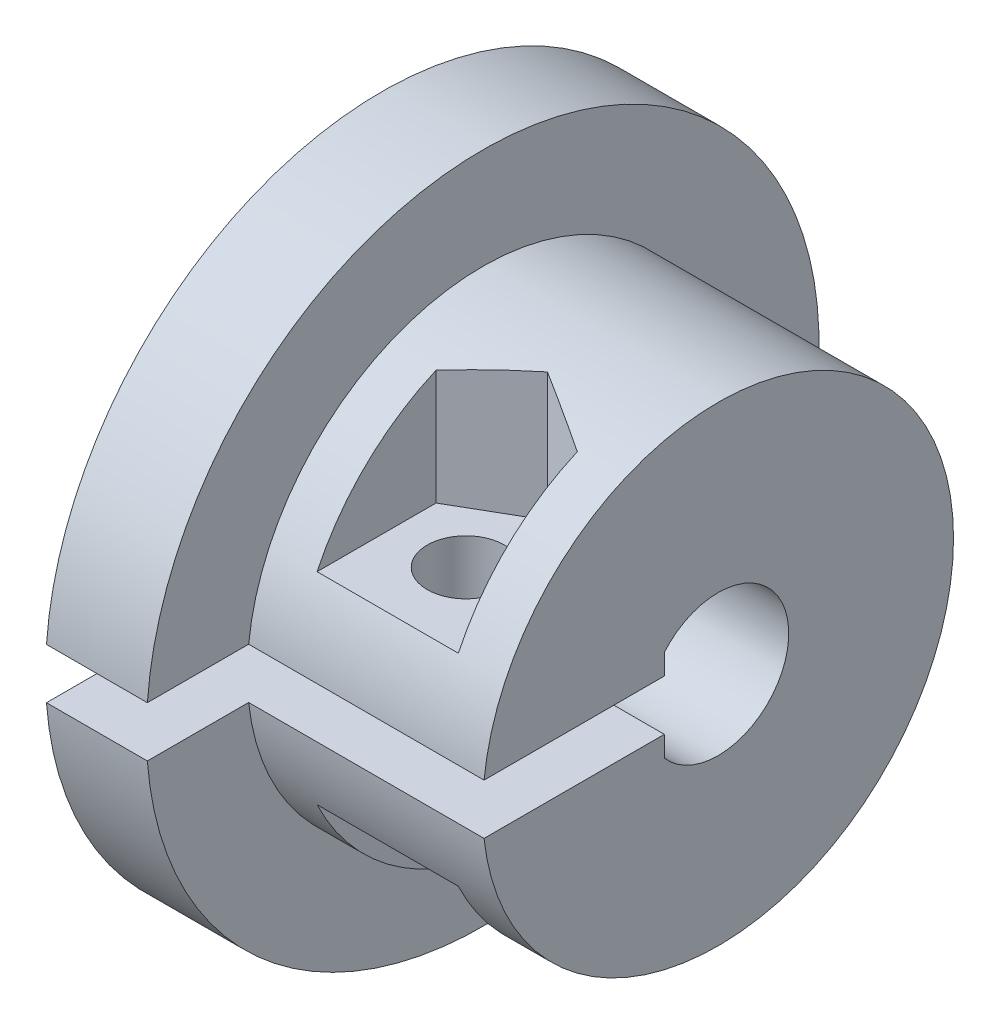
ISO-10303-21;
HEADER;
FILE_DESCRIPTION(('STEP AP214'),'2;1');
FILE_NAME('part.step','',(''),(''),'','','');
FILE_SCHEMA(('AUTOMOTIVE_DESIGN { 1 0 10303 214 1 1 1 1 }'));
ENDSEC;
DATA;
#1=APPLICATION_CONTEXT('core data for automotive mechanical design processes');
#2=APPLICATION_PROTOCOL_DEFINITION('international standard','automotive_design',2000,#1);
#3=PRODUCT_CONTEXT('',#1,'mechanical');
#4=PRODUCT('Part','Part','',(#3));
#5=PRODUCT_RELATED_PRODUCT_CATEGORY('part','',(#4));
#6=PRODUCT_DEFINITION_FORMATION('','',#4);
#7=PRODUCT_DEFINITION_CONTEXT('part definition',#1,'design');
#8=PRODUCT_DEFINITION('design','',#6,#7);
#9=PRODUCT_DEFINITION_SHAPE('','',#8);
#10=(LENGTH_UNIT() NAMED_UNIT(*) SI_UNIT(.MILLI.,.METRE.));
#11=(NAMED_UNIT(*) PLANE_ANGLE_UNIT() SI_UNIT($,.RADIAN.));
#12=(NAMED_UNIT(*) SI_UNIT($,.STERADIAN.) SOLID_ANGLE_UNIT());
#13=UNCERTAINTY_MEASURE_WITH_UNIT(LENGTH_MEASURE(1.E-05),#10,'distance_accuracy_value','');
#14=(GEOMETRIC_REPRESENTATION_CONTEXT(3) GLOBAL_UNCERTAINTY_ASSIGNED_CONTEXT((#13)) GLOBAL_UNIT_ASSIGNED_CONTEXT((#10,
#11,#12)) REPRESENTATION_CONTEXT('',''));
#15=CARTESIAN_POINT('',(0.,0.,0.));
#16=DIRECTION('',(0.,0.,1.));
#17=DIRECTION('',(1.,0.,0.));
#18=AXIS2_PLACEMENT_3D('',#15,#16,#17);
#19=CARTESIAN_POINT('',(0.,0.,0.));
#20=DIRECTION('',(1.,0.,0.));
#21=DIRECTION('',(0.,1.,0.));
#22=AXIS2_PLACEMENT_3D('',#19,#20,#21);
#23=PLANE('',#22);
#24=CARTESIAN_POINT('',(0.,-5.,0.));
#25=DIRECTION('',(1.,0.,0.));
#26=DIRECTION('',(0.,0.,1.));
#27=AXIS2_PLACEMENT_3D('',#24,#25,#26);
#28=CIRCLE('',#27,3.25);
#29=CARTESIAN_POINT('',(0.,-5.,-3.25));
#30=VERTEX_POINT('',#29);
#31=EDGE_CURVE('E303',#30,#30,#28,.T.);
#32=ORIENTED_EDGE('',*,*,#31,.T.);
#33=EDGE_LOOP('',(#32));
#34=FACE_BOUND('',#33,.T.);
#35=CARTESIAN_POINT('',(0.,5.,0.));
#36=DIRECTION('',(1.,0.,0.));
#37=DIRECTION('',(0.,0.,1.));
#38=AXIS2_PLACEMENT_3D('',#35,#36,#37);
#39=CIRCLE('',#38,3.25);
#40=CARTESIAN_POINT('',(0.,5.,-3.25));
#41=VERTEX_POINT('',#40);
#42=EDGE_CURVE('E191',#41,#41,#39,.T.);
#43=ORIENTED_EDGE('',*,*,#42,.T.);
#44=EDGE_LOOP('',(#43));
#45=FACE_BOUND('',#44,.T.);
#46=DIRECTION('',(0.,0.,1.));
#47=VECTOR('',#46,1.);
#48=CARTESIAN_POINT('',(0.,0.75,4.98591766879478));
#49=LINE('',#48,#47);
#50=CARTESIAN_POINT('',(0.,0.75,0.));
#51=VERTEX_POINT('',#50);
#52=CARTESIAN_POINT('',(0.,0.75,9.97183533758957));
#53=VERTEX_POINT('',#52);
#54=EDGE_CURVE('E196',#51,#53,#49,.T.);
#55=ORIENTED_EDGE('',*,*,#54,.T.);
#56=CARTESIAN_POINT('',(0.,0.,0.));
#57=DIRECTION('',(1.,0.,0.));
#58=DIRECTION('',(0.,0.,-1.));
#59=AXIS2_PLACEMENT_3D('',#56,#57,#58);
#60=CIRCLE('',#59,10.);
#61=CARTESIAN_POINT('',(0.,-0.74999999999999,9.97183533758957));
#62=VERTEX_POINT('',#61);
#63=EDGE_CURVE('E11',#62,#53,#60,.T.);
#64=ORIENTED_EDGE('',*,*,#63,.F.);
#65=DIRECTION('',(0.,0.,-1.));
#66=VECTOR('',#65,1.);
#67=CARTESIAN_POINT('',(0.,-0.75,0.));
#68=LINE('',#67,#66);
#69=CARTESIAN_POINT('',(0.,-0.75,0.));
#70=VERTEX_POINT('',#69);
#71=EDGE_CURVE('E216',#62,#70,#68,.T.);
#72=ORIENTED_EDGE('',*,*,#71,.T.);
#73=CARTESIAN_POINT('',(0.,0.,0.));
#74=DIRECTION('',(1.,0.,0.));
#75=DIRECTION('',(0.,-1.,0.));
#76=AXIS2_PLACEMENT_3D('',#73,#74,#75);
#77=CIRCLE('',#76,0.75);
#78=EDGE_CURVE('E352',#70,#51,#77,.T.);
#79=ORIENTED_EDGE('',*,*,#78,.T.);
#80=EDGE_LOOP('',(#55,#64,#72,#79));
#81=FACE_BOUND('',#80,.T.);
#82=ADVANCED_FACE('F17',(#34,#45,#81),#23,.F.);
#83=CARTESIAN_POINT('',(3.,0.,0.));
#84=DIRECTION('',(1.,0.,0.));
#85=DIRECTION('',(0.,1.,0.));
#86=AXIS2_PLACEMENT_3D('',#83,#84,#85);
#87=PLANE('',#86);
#88=DIRECTION('',(0.,0.,-1.));
#89=VECTOR('',#88,1.);
#90=CARTESIAN_POINT('',(3.,0.75,4.98591766879478));
#91=LINE('',#90,#89);
#92=CARTESIAN_POINT('',(3.,0.75,9.97183533758957));
#93=VERTEX_POINT('',#92);
#94=CARTESIAN_POINT('',(3.,0.75,6.95970545353753));
#95=VERTEX_POINT('',#94);
#96=EDGE_CURVE('E336',#93,#95,#91,.T.);
#97=ORIENTED_EDGE('',*,*,#96,.T.);
#98=CARTESIAN_POINT('',(3.,0.,0.));
#99=DIRECTION('',(-1.,0.,0.));
#100=DIRECTION('',(0.,0.,-1.));
#101=AXIS2_PLACEMENT_3D('',#98,#99,#100);
#102=CIRCLE('',#101,7.);
#103=CARTESIAN_POINT('',(3.,-0.75,6.95970545353753));
#104=VERTEX_POINT('',#103);
#105=EDGE_CURVE('E291',#95,#104,#102,.T.);
#106=ORIENTED_EDGE('',*,*,#105,.T.);
#107=DIRECTION('',(0.,0.,1.));
#108=VECTOR('',#107,1.);
#109=CARTESIAN_POINT('',(3.,-0.75,0.));
#110=LINE('',#109,#108);
#111=CARTESIAN_POINT('',(3.,-0.75,9.97183533758957));
#112=VERTEX_POINT('',#111);
#113=EDGE_CURVE('E231',#104,#112,#110,.T.);
#114=ORIENTED_EDGE('',*,*,#113,.T.);
#115=CARTESIAN_POINT('',(3.,0.,0.));
#116=DIRECTION('',(1.,0.,0.));
#117=DIRECTION('',(0.,0.,-1.));
#118=AXIS2_PLACEMENT_3D('',#115,#116,#117);
#119=CIRCLE('',#118,10.);
#120=EDGE_CURVE('E28',#112,#93,#119,.T.);
#121=ORIENTED_EDGE('',*,*,#120,.T.);
#122=EDGE_LOOP('',(#97,#106,#114,#121));
#123=FACE_BOUND('',#122,.T.);
#124=ADVANCED_FACE('F418',(#123),#87,.T.);
#125=CARTESIAN_POINT('',(0.,0.,0.));
#126=DIRECTION('',(1.,0.,0.));
#127=DIRECTION('',(0.,0.,-1.));
#128=AXIS2_PLACEMENT_3D('',#125,#126,#127);
#129=CYLINDRICAL_SURFACE('',#128,10.);
#130=DIRECTION('',(1.,0.,0.));
#131=VECTOR('',#130,1.);
#132=CARTESIAN_POINT('',(0.,0.75,9.97183533758957));
#133=LINE('',#132,#131);
#134=EDGE_CURVE('E200',#53,#93,#133,.T.);
#135=ORIENTED_EDGE('',*,*,#134,.T.);
#136=ORIENTED_EDGE('',*,*,#120,.F.);
#137=DIRECTION('',(-1.,0.,0.));
#138=VECTOR('',#137,1.);
#139=CARTESIAN_POINT('',(0.,-0.75,9.97183533758957));
#140=LINE('',#139,#138);
#141=EDGE_CURVE('E227',#112,#62,#140,.T.);
#142=ORIENTED_EDGE('',*,*,#141,.T.);
#143=ORIENTED_EDGE('',*,*,#63,.T.);
#144=EDGE_LOOP('',(#135,#136,#142,#143));
#145=FACE_BOUND('',#144,.T.);
#146=ADVANCED_FACE('F426',(#145),#129,.T.);
#147=CARTESIAN_POINT('',(10.,-1.36014705087354,1.6));
#148=DIRECTION('',(0.,0.,1.));
#149=DIRECTION('',(0.,-1.,0.));
#150=AXIS2_PLACEMENT_3D('',#147,#148,#149);
#151=PLANE('',#150);
#152=DIRECTION('',(-1.,0.,0.));
#153=VECTOR('',#152,1.);
#154=CARTESIAN_POINT('',(10.,0.75,1.6));
#155=LINE('',#154,#153);
#156=CARTESIAN_POINT('',(10.,0.75,1.6));
#157=VERTEX_POINT('',#156);
#158=CARTESIAN_POINT('',(3.,0.75,1.6));
#159=VERTEX_POINT('',#158);
#160=EDGE_CURVE('E232',#157,#159,#155,.T.);
#161=ORIENTED_EDGE('',*,*,#160,.T.);
#162=DIRECTION('',(0.,1.,0.));
#163=VECTOR('',#162,1.);
#164=CARTESIAN_POINT('',(3.,1.36014705087354,1.6));
#165=LINE('',#164,#163);
#166=CARTESIAN_POINT('',(3.,1.36014705087354,1.6));
#167=VERTEX_POINT('',#166);
#168=EDGE_CURVE('E188',#159,#167,#165,.T.);
#169=ORIENTED_EDGE('',*,*,#168,.T.);
#170=DIRECTION('',(-1.,0.,0.));
#171=VECTOR('',#170,1.);
#172=CARTESIAN_POINT('',(10.,1.36014705087354,1.6));
#173=LINE('',#172,#171);
#174=CARTESIAN_POINT('',(10.,1.36014705087354,1.6));
#175=VERTEX_POINT('',#174);
#176=EDGE_CURVE('E184',#175,#167,#173,.T.);
#177=ORIENTED_EDGE('',*,*,#176,.F.);
#178=DIRECTION('',(0.,1.,0.));
#179=VECTOR('',#178,1.);
#180=CARTESIAN_POINT('',(10.,-0.680073525436771,1.6));
#181=LINE('',#180,#179);
#182=EDGE_CURVE('E241',#157,#175,#181,.T.);
#183=ORIENTED_EDGE('',*,*,#182,.F.);
#184=EDGE_LOOP('',(#161,#169,#177,#183));
#185=FACE_BOUND('',#184,.T.);
#186=ADVANCED_FACE('F568',(#185),#151,.F.);
#187=CARTESIAN_POINT('',(10.,0.,0.));
#188=DIRECTION('',(-1.,0.,0.));
#189=DIRECTION('',(0.,0.,-1.));
#190=AXIS2_PLACEMENT_3D('',#187,#188,#189);
#191=CYLINDRICAL_SURFACE('',#190,2.1);
#192=CARTESIAN_POINT('',(10.,0.,0.));
#193=DIRECTION('',(-1.,0.,0.));
#194=DIRECTION('',(0.,-0.647689071844544,0.761904761904763));
#195=AXIS2_PLACEMENT_3D('',#192,#193,#194);
#196=CIRCLE('',#195,2.1);
#197=CARTESIAN_POINT('',(10.,-1.36014705087354,1.6));
#198=VERTEX_POINT('',#197);
#199=EDGE_CURVE('E245',#175,#198,#196,.T.);
#200=ORIENTED_EDGE('',*,*,#199,.F.);
#201=ORIENTED_EDGE('',*,*,#176,.T.);
#202=CARTESIAN_POINT('',(3.,0.,0.));
#203=DIRECTION('',(-1.,0.,0.));
#204=DIRECTION('',(0.,-0.647689071844544,0.761904761904763));
#205=AXIS2_PLACEMENT_3D('',#202,#203,#204);
#206=CIRCLE('',#205,2.1);
#207=CARTESIAN_POINT('',(3.,-1.36014705087354,1.6));
#208=VERTEX_POINT('',#207);
#209=EDGE_CURVE('E185',#167,#208,#206,.T.);
#210=ORIENTED_EDGE('',*,*,#209,.T.);
#211=DIRECTION('',(-1.,0.,0.));
#212=VECTOR('',#211,1.);
#213=CARTESIAN_POINT('',(10.,-1.36014705087354,1.6));
#214=LINE('',#213,#212);
#215=EDGE_CURVE('E246',#198,#208,#214,.T.);
#216=ORIENTED_EDGE('',*,*,#215,.F.);
#217=EDGE_LOOP('',(#200,#201,#210,#216));
#218=FACE_BOUND('',#217,.T.);
#219=ADVANCED_FACE('F597',(#218),#191,.F.);
#220=CARTESIAN_POINT('',(8.6,3.,7.));
#221=DIRECTION('',(1.,0.,0.));
#222=DIRECTION('',(0.,0.,1.));
#223=AXIS2_PLACEMENT_3D('',#220,#221,#222);
#224=PLANE('',#223);
#225=CARTESIAN_POINT('',(8.6,0.,0.));
#226=DIRECTION('',(1.,0.,0.));
#227=DIRECTION('',(0.,0.,-1.));
#228=AXIS2_PLACEMENT_3D('',#225,#226,#227);
#229=CIRCLE('',#228,7.);
#230=CARTESIAN_POINT('',(8.6,6.42101896293615,2.7875644347018));
#231=VERTEX_POINT('',#230);
#232=CARTESIAN_POINT('',(8.6,3.,6.32455532033676));
#233=VERTEX_POINT('',#232);
#234=EDGE_CURVE('E163',#231,#233,#229,.T.);
#235=ORIENTED_EDGE('',*,*,#234,.F.);
#236=DIRECTION('',(0.,1.,0.));
#237=VECTOR('',#236,1.);
#238=CARTESIAN_POINT('',(8.6,3.,2.7875644347018));
#239=LINE('',#238,#237);
#240=CARTESIAN_POINT('',(8.6,3.,2.7875644347018));
#241=VERTEX_POINT('',#240);
#242=EDGE_CURVE('E156',#241,#231,#239,.T.);
#243=ORIENTED_EDGE('',*,*,#242,.F.);
#244=DIRECTION('',(0.,0.,-1.));
#245=VECTOR('',#244,1.);
#246=CARTESIAN_POINT('',(8.6,3.,7.));
#247=LINE('',#246,#245);
#248=EDGE_CURVE('E113',#233,#241,#247,.T.);
#249=ORIENTED_EDGE('',*,*,#248,.F.);
#250=EDGE_LOOP('',(#235,#243,#249));
#251=FACE_BOUND('',#250,.T.);
#252=ADVANCED_FACE('F583',(#251),#224,.F.);
#253=CARTESIAN_POINT('',(8.6,3.,2.7875644347018));
#254=DIRECTION('',(0.5,0.,-0.866025403784436));
#255=DIRECTION('',(0.,-1.,0.));
#256=AXIS2_PLACEMENT_3D('',#253,#254,#255);
#257=PLANE('',#256);
#258=CARTESIAN_POINT('',(3.77179676972451,0.,0.));
#259=DIRECTION('',(0.5,0.,-0.866025403784436));
#260=DIRECTION('',(-0.866025403784436,0.,-0.5));
#261=AXIS2_PLACEMENT_3D('',#258,#259,#260);
#262=ELLIPSE('',#261,14.,7.);
#263=CARTESIAN_POINT('',(6.5,6.82048158451963,1.57512886940357));
#264=VERTEX_POINT('',#263);
#265=EDGE_CURVE('E159',#264,#231,#262,.T.);
#266=ORIENTED_EDGE('',*,*,#265,.F.);
#267=DIRECTION('',(0.,1.,0.));
#268=VECTOR('',#267,1.);
#269=CARTESIAN_POINT('',(6.5,3.,1.57512886940357));
#270=LINE('',#269,#268);
#271=CARTESIAN_POINT('',(6.5,3.,1.57512886940357));
#272=VERTEX_POINT('',#271);
#273=EDGE_CURVE('E144',#272,#264,#270,.T.);
#274=ORIENTED_EDGE('',*,*,#273,.F.);
#275=DIRECTION('',(0.866025403784436,0.,0.5));
#276=VECTOR('',#275,1.);
#277=CARTESIAN_POINT('',(6.5,3.,1.57512886940357));
#278=LINE('',#277,#276);
#279=EDGE_CURVE('E209',#272,#241,#278,.T.);
#280=ORIENTED_EDGE('',*,*,#279,.T.);
#281=ORIENTED_EDGE('',*,*,#242,.T.);
#282=EDGE_LOOP('',(#266,#274,#280,#281));
#283=FACE_BOUND('',#282,.T.);
#284=ADVANCED_FACE('F160',(#283),#257,.F.);
#285=CARTESIAN_POINT('',(6.5,3.,1.57512886940357));
#286=DIRECTION('',(-0.5,0.,-0.866025403784439));
#287=DIRECTION('',(-0.866025403784439,0.,0.5));
#288=AXIS2_PLACEMENT_3D('',#285,#286,#287);
#289=PLANE('',#288);
#290=CARTESIAN_POINT('',(9.22820323027552,0.,0.));
#291=DIRECTION('',(-0.5,0.,-0.866025403784439));
#292=DIRECTION('',(0.866025403784439,0.,-0.5));
#293=AXIS2_PLACEMENT_3D('',#290,#291,#292);
#294=ELLIPSE('',#293,14.,7.);
#295=CARTESIAN_POINT('',(4.4,6.42101896293616,2.78756443470178));
#296=VERTEX_POINT('',#295);
#297=EDGE_CURVE('E148',#296,#264,#294,.T.);
#298=ORIENTED_EDGE('',*,*,#297,.F.);
#299=DIRECTION('',(0.,1.,0.));
#300=VECTOR('',#299,1.);
#301=CARTESIAN_POINT('',(4.4,3.,2.78756443470178));
#302=LINE('',#301,#300);
#303=CARTESIAN_POINT('',(4.4,3.,2.78756443470178));
#304=VERTEX_POINT('',#303);
#305=EDGE_CURVE('E42',#304,#296,#302,.T.);
#306=ORIENTED_EDGE('',*,*,#305,.F.);
#307=DIRECTION('',(0.866025403784439,0.,-0.5));
#308=VECTOR('',#307,1.);
#309=CARTESIAN_POINT('',(4.4,3.,2.78756443470178));
#310=LINE('',#309,#308);
#311=EDGE_CURVE('E151',#304,#272,#310,.T.);
#312=ORIENTED_EDGE('',*,*,#311,.T.);
#313=ORIENTED_EDGE('',*,*,#273,.T.);
#314=EDGE_LOOP('',(#298,#306,#312,#313));
#315=FACE_BOUND('',#314,.T.);
#316=ADVANCED_FACE('F146',(#315),#289,.F.);
#317=CARTESIAN_POINT('',(4.4,3.,2.78756443470178));
#318=DIRECTION('',(-1.,0.,0.));
#319=DIRECTION('',(0.,1.,0.));
#320=AXIS2_PLACEMENT_3D('',#317,#318,#319);
#321=PLANE('',#320);
#322=CARTESIAN_POINT('',(4.4,0.,0.));
#323=DIRECTION('',(-1.,0.,0.));
#324=DIRECTION('',(0.,0.,-1.));
#325=AXIS2_PLACEMENT_3D('',#322,#323,#324);
#326=CIRCLE('',#325,7.);
#327=CARTESIAN_POINT('',(4.4,3.,6.32455532033676));
#328=VERTEX_POINT('',#327);
#329=EDGE_CURVE('E168',#328,#296,#326,.T.);
#330=ORIENTED_EDGE('',*,*,#329,.F.);
#331=DIRECTION('',(0.,0.,1.));
#332=VECTOR('',#331,1.);
#333=CARTESIAN_POINT('',(4.4,3.,2.78756443470178));
#334=LINE('',#333,#332);
#335=EDGE_CURVE('E181',#304,#328,#334,.T.);
#336=ORIENTED_EDGE('',*,*,#335,.F.);
#337=ORIENTED_EDGE('',*,*,#305,.T.);
#338=EDGE_LOOP('',(#330,#336,#337));
#339=FACE_BOUND('',#338,.T.);
#340=ADVANCED_FACE('F574',(#339),#321,.F.);
#341=CARTESIAN_POINT('',(6.5,3.,4.28756443470179));
#342=DIRECTION('',(0.,1.,0.));
#343=DIRECTION('',(1.,0.,0.));
#344=AXIS2_PLACEMENT_3D('',#341,#342,#343);
#345=PLANE('',#344);
#346=CARTESIAN_POINT('',(6.5,3.,4.));
#347=DIRECTION('',(0.,-1.,0.));
#348=DIRECTION('',(-1.,0.,0.));
#349=AXIS2_PLACEMENT_3D('',#346,#347,#348);
#350=CIRCLE('',#349,1.15);
#351=CARTESIAN_POINT('',(7.65,3.,4.));
#352=VERTEX_POINT('',#351);
#353=EDGE_CURVE('E330',#352,#352,#350,.T.);
#354=ORIENTED_EDGE('',*,*,#353,.T.);
#355=EDGE_LOOP('',(#354));
#356=FACE_BOUND('',#355,.T.);
#357=DIRECTION('',(-1.,0.,0.));
#358=VECTOR('',#357,1.);
#359=CARTESIAN_POINT('',(3.,3.,6.32455532033676));
#360=LINE('',#359,#358);
#361=EDGE_CURVE('E175',#233,#328,#360,.T.);
#362=ORIENTED_EDGE('',*,*,#361,.F.);
#363=ORIENTED_EDGE('',*,*,#248,.T.);
#364=ORIENTED_EDGE('',*,*,#279,.F.);
#365=ORIENTED_EDGE('',*,*,#311,.F.);
#366=ORIENTED_EDGE('',*,*,#335,.T.);
#367=EDGE_LOOP('',(#362,#363,#364,#365,#366));
#368=FACE_BOUND('',#367,.T.);
#369=ADVANCED_FACE('F577',(#356,#368),#345,.T.);
#370=CARTESIAN_POINT('',(3.,0.,0.));
#371=DIRECTION('',(1.,0.,0.));
#372=DIRECTION('',(0.,0.,-1.));
#373=AXIS2_PLACEMENT_3D('',#370,#371,#372);
#374=CYLINDRICAL_SURFACE('',#373,7.);
#375=DIRECTION('',(-1.,0.,0.));
#376=VECTOR('',#375,1.);
#377=CARTESIAN_POINT('',(3.,-3.,6.32455532033676));
#378=LINE('',#377,#376);
#379=CARTESIAN_POINT('',(8.6,-3.,6.32455532033676));
#380=VERTEX_POINT('',#379);
#381=CARTESIAN_POINT('',(4.4,-3.,6.32455532033676));
#382=VERTEX_POINT('',#381);
#383=EDGE_CURVE('E393',#380,#382,#378,.T.);
#384=ORIENTED_EDGE('',*,*,#383,.F.);
#385=CARTESIAN_POINT('',(8.6,0.,0.));
#386=DIRECTION('',(-1.,0.,0.));
#387=DIRECTION('',(0.,0.,-1.));
#388=AXIS2_PLACEMENT_3D('',#385,#386,#387);
#389=CIRCLE('',#388,7.);
#390=CARTESIAN_POINT('',(8.6,-6.42101896293615,2.7875644347018));
#391=VERTEX_POINT('',#390);
#392=EDGE_CURVE('E130',#391,#380,#389,.T.);
#393=ORIENTED_EDGE('',*,*,#392,.F.);
#394=CARTESIAN_POINT('',(3.77179676972451,0.,0.));
#395=DIRECTION('',(-0.5,0.,0.866025403784436));
#396=DIRECTION('',(-0.866025403784436,0.,-0.5));
#397=AXIS2_PLACEMENT_3D('',#394,#395,#396);
#398=ELLIPSE('',#397,14.,7.);
#399=CARTESIAN_POINT('',(6.5,-6.82048158451963,1.57512886940357));
#400=VERTEX_POINT('',#399);
#401=EDGE_CURVE('E339',#400,#391,#398,.T.);
#402=ORIENTED_EDGE('',*,*,#401,.F.);
#403=CARTESIAN_POINT('',(9.22820323027552,0.,0.));
#404=DIRECTION('',(0.5,0.,0.866025403784439));
#405=DIRECTION('',(0.866025403784439,0.,-0.5));
#406=AXIS2_PLACEMENT_3D('',#403,#404,#405);
#407=ELLIPSE('',#406,14.,7.);
#408=CARTESIAN_POINT('',(4.4,-6.42101896293616,2.78756443470178));
#409=VERTEX_POINT('',#408);
#410=EDGE_CURVE('E221',#409,#400,#407,.T.);
#411=ORIENTED_EDGE('',*,*,#410,.F.);
#412=CARTESIAN_POINT('',(4.4,0.,0.));
#413=DIRECTION('',(1.,0.,0.));
#414=DIRECTION('',(0.,0.,-1.));
#415=AXIS2_PLACEMENT_3D('',#412,#413,#414);
#416=CIRCLE('',#415,7.);
#417=EDGE_CURVE('E21',#382,#409,#416,.T.);
#418=ORIENTED_EDGE('',*,*,#417,.F.);
#419=EDGE_LOOP('',(#384,#393,#402,#411,#418));
#420=FACE_BOUND('',#419,.T.);
#421=ORIENTED_EDGE('',*,*,#361,.T.);
#422=ORIENTED_EDGE('',*,*,#329,.T.);
#423=ORIENTED_EDGE('',*,*,#297,.T.);
#424=ORIENTED_EDGE('',*,*,#265,.T.);
#425=ORIENTED_EDGE('',*,*,#234,.T.);
#426=EDGE_LOOP('',(#421,#422,#423,#424,#425));
#427=FACE_BOUND('',#426,.T.);
#428=DIRECTION('',(1.,0.,0.));
#429=VECTOR('',#428,1.);
#430=CARTESIAN_POINT('',(3.,0.75,6.95970545353753));
#431=LINE('',#430,#429);
#432=CARTESIAN_POINT('',(10.,0.75,6.95970545353753));
#433=VERTEX_POINT('',#432);
#434=EDGE_CURVE('E377',#95,#433,#431,.T.);
#435=ORIENTED_EDGE('',*,*,#434,.T.);
#436=CARTESIAN_POINT('',(10.,0.,0.));
#437=DIRECTION('',(1.,0.,0.));
#438=DIRECTION('',(0.,0.,-1.));
#439=AXIS2_PLACEMENT_3D('',#436,#437,#438);
#440=CIRCLE('',#439,7.);
#441=CARTESIAN_POINT('',(10.,-0.75,6.95970545353753));
#442=VERTEX_POINT('',#441);
#443=EDGE_CURVE('E385',#442,#433,#440,.T.);
#444=ORIENTED_EDGE('',*,*,#443,.F.);
#445=DIRECTION('',(-1.,0.,0.));
#446=VECTOR('',#445,1.);
#447=CARTESIAN_POINT('',(3.,-0.75,6.95970545353753));
#448=LINE('',#447,#446);
#449=EDGE_CURVE('E208',#442,#104,#448,.T.);
#450=ORIENTED_EDGE('',*,*,#449,.T.);
#451=ORIENTED_EDGE('',*,*,#105,.F.);
#452=EDGE_LOOP('',(#435,#444,#450,#451));
#453=FACE_BOUND('',#452,.T.);
#454=ADVANCED_FACE('F166',(#420,#427,#453),#374,.T.);
#455=CARTESIAN_POINT('',(8.6,-3.,7.));
#456=DIRECTION('',(-1.,0.,0.));
#457=DIRECTION('',(0.,0.,1.));
#458=AXIS2_PLACEMENT_3D('',#455,#456,#457);
#459=PLANE('',#458);
#460=ORIENTED_EDGE('',*,*,#392,.T.);
#461=DIRECTION('',(0.,0.,-1.));
#462=VECTOR('',#461,1.);
#463=CARTESIAN_POINT('',(8.6,-3.,7.));
#464=LINE('',#463,#462);
#465=CARTESIAN_POINT('',(8.6,-3.,2.7875644347018));
#466=VERTEX_POINT('',#465);
#467=EDGE_CURVE('E346',#380,#466,#464,.T.);
#468=ORIENTED_EDGE('',*,*,#467,.T.);
#469=DIRECTION('',(0.,-1.,0.));
#470=VECTOR('',#469,1.);
#471=CARTESIAN_POINT('',(8.6,-3.,2.7875644347018));
#472=LINE('',#471,#470);
#473=EDGE_CURVE('E292',#466,#391,#472,.T.);
#474=ORIENTED_EDGE('',*,*,#473,.T.);
#475=EDGE_LOOP('',(#460,#468,#474));
#476=FACE_BOUND('',#475,.T.);
#477=ADVANCED_FACE('F508',(#476),#459,.T.);
#478=CARTESIAN_POINT('',(8.6,-3.,2.7875644347018));
#479=DIRECTION('',(-0.5,0.,0.866025403784436));
#480=DIRECTION('',(0.,1.,0.));
#481=AXIS2_PLACEMENT_3D('',#478,#479,#480);
#482=PLANE('',#481);
#483=ORIENTED_EDGE('',*,*,#401,.T.);
#484=ORIENTED_EDGE('',*,*,#473,.F.);
#485=DIRECTION('',(0.866025403784436,0.,0.5));
#486=VECTOR('',#485,1.);
#487=CARTESIAN_POINT('',(6.5,-3.,1.57512886940357));
#488=LINE('',#487,#486);
#489=CARTESIAN_POINT('',(6.5,-3.,1.57512886940357));
#490=VERTEX_POINT('',#489);
#491=EDGE_CURVE('E250',#490,#466,#488,.T.);
#492=ORIENTED_EDGE('',*,*,#491,.F.);
#493=DIRECTION('',(0.,-1.,0.));
#494=VECTOR('',#493,1.);
#495=CARTESIAN_POINT('',(6.5,-3.,1.57512886940357));
#496=LINE('',#495,#494);
#497=EDGE_CURVE('E226',#490,#400,#496,.T.);
#498=ORIENTED_EDGE('',*,*,#497,.T.);
#499=EDGE_LOOP('',(#483,#484,#492,#498));
#500=FACE_BOUND('',#499,.T.);
#501=ADVANCED_FACE('F505',(#500),#482,.T.);
#502=CARTESIAN_POINT('',(6.5,-3.,1.57512886940357));
#503=DIRECTION('',(0.5,0.,0.866025403784439));
#504=DIRECTION('',(0.,-1.,0.));
#505=AXIS2_PLACEMENT_3D('',#502,#503,#504);
#506=PLANE('',#505);
#507=ORIENTED_EDGE('',*,*,#410,.T.);
#508=ORIENTED_EDGE('',*,*,#497,.F.);
#509=DIRECTION('',(0.866025403784439,0.,-0.5));
#510=VECTOR('',#509,1.);
#511=CARTESIAN_POINT('',(4.4,-3.,2.78756443470178));
#512=LINE('',#511,#510);
#513=CARTESIAN_POINT('',(4.4,-3.,2.78756443470178));
#514=VERTEX_POINT('',#513);
#515=EDGE_CURVE('E247',#514,#490,#512,.T.);
#516=ORIENTED_EDGE('',*,*,#515,.F.);
#517=DIRECTION('',(0.,-1.,0.));
#518=VECTOR('',#517,1.);
#519=CARTESIAN_POINT('',(4.4,-3.,2.78756443470178));
#520=LINE('',#519,#518);
#521=EDGE_CURVE('E218',#514,#409,#520,.T.);
#522=ORIENTED_EDGE('',*,*,#521,.T.);
#523=EDGE_LOOP('',(#507,#508,#516,#522));
#524=FACE_BOUND('',#523,.T.);
#525=ADVANCED_FACE('F514',(#524),#506,.T.);
#526=CARTESIAN_POINT('',(4.4,-3.,2.78756443470178));
#527=DIRECTION('',(1.,0.,0.));
#528=DIRECTION('',(0.,0.,-1.));
#529=AXIS2_PLACEMENT_3D('',#526,#527,#528);
#530=PLANE('',#529);
#531=ORIENTED_EDGE('',*,*,#417,.T.);
#532=ORIENTED_EDGE('',*,*,#521,.F.);
#533=DIRECTION('',(0.,0.,1.));
#534=VECTOR('',#533,1.);
#535=CARTESIAN_POINT('',(4.4,-3.,2.78756443470178));
#536=LINE('',#535,#534);
#537=EDGE_CURVE('E251',#514,#382,#536,.T.);
#538=ORIENTED_EDGE('',*,*,#537,.T.);
#539=EDGE_LOOP('',(#531,#532,#538));
#540=FACE_BOUND('',#539,.T.);
#541=ADVANCED_FACE('F518',(#540),#530,.T.);
#542=CARTESIAN_POINT('',(6.5,-3.,4.28756443470179));
#543=DIRECTION('',(0.,1.,0.));
#544=DIRECTION('',(1.,0.,0.));
#545=AXIS2_PLACEMENT_3D('',#542,#543,#544);
#546=PLANE('',#545);
#547=CARTESIAN_POINT('',(6.5,-3.,4.));
#548=DIRECTION('',(0.,1.,0.));
#549=DIRECTION('',(-1.,0.,0.));
#550=AXIS2_PLACEMENT_3D('',#547,#548,#549);
#551=CIRCLE('',#550,1.15);
#552=CARTESIAN_POINT('',(7.65,-3.,4.));
#553=VERTEX_POINT('',#552);
#554=EDGE_CURVE('E255',#553,#553,#551,.T.);
#555=ORIENTED_EDGE('',*,*,#554,.T.);
#556=EDGE_LOOP('',(#555));
#557=FACE_BOUND('',#556,.T.);
#558=ORIENTED_EDGE('',*,*,#383,.T.);
#559=ORIENTED_EDGE('',*,*,#537,.F.);
#560=ORIENTED_EDGE('',*,*,#515,.T.);
#561=ORIENTED_EDGE('',*,*,#491,.T.);
#562=ORIENTED_EDGE('',*,*,#467,.F.);
#563=EDGE_LOOP('',(#558,#559,#560,#561,#562));
#564=FACE_BOUND('',#563,.T.);
#565=ADVANCED_FACE('F510',(#557,#564),#546,.F.);
#566=CARTESIAN_POINT('',(10.,0.,0.));
#567=DIRECTION('',(1.,0.,0.));
#568=DIRECTION('',(0.,1.,0.));
#569=AXIS2_PLACEMENT_3D('',#566,#567,#568);
#570=PLANE('',#569);
#571=DIRECTION('',(0.,0.,-1.));
#572=VECTOR('',#571,1.);
#573=CARTESIAN_POINT('',(10.,0.75,4.98591766879478));
#574=LINE('',#573,#572);
#575=EDGE_CURVE('E236',#433,#157,#574,.T.);
#576=ORIENTED_EDGE('',*,*,#575,.T.);
#577=ORIENTED_EDGE('',*,*,#182,.T.);
#578=ORIENTED_EDGE('',*,*,#199,.T.);
#579=DIRECTION('',(0.,1.,0.));
#580=VECTOR('',#579,1.);
#581=CARTESIAN_POINT('',(10.,-0.680073525436771,1.6));
#582=LINE('',#581,#580);
#583=CARTESIAN_POINT('',(10.,-0.75,1.6));
#584=VERTEX_POINT('',#583);
#585=EDGE_CURVE('E310',#198,#584,#582,.T.);
#586=ORIENTED_EDGE('',*,*,#585,.T.);
#587=DIRECTION('',(0.,0.,1.));
#588=VECTOR('',#587,1.);
#589=CARTESIAN_POINT('',(10.,-0.75,0.));
#590=LINE('',#589,#588);
#591=EDGE_CURVE('E203',#584,#442,#590,.T.);
#592=ORIENTED_EDGE('',*,*,#591,.T.);
#593=ORIENTED_EDGE('',*,*,#443,.T.);
#594=EDGE_LOOP('',(#576,#577,#578,#586,#592,#593));
#595=FACE_BOUND('',#594,.T.);
#596=ADVANCED_FACE('F527',(#595),#570,.T.);
#597=CARTESIAN_POINT('',(10.,-1.36014705087354,1.6));
#598=DIRECTION('',(0.,0.,1.));
#599=DIRECTION('',(0.,-1.,0.));
#600=AXIS2_PLACEMENT_3D('',#597,#598,#599);
#601=PLANE('',#600);
#602=DIRECTION('',(1.,0.,0.));
#603=VECTOR('',#602,1.);
#604=CARTESIAN_POINT('',(10.,-0.75,1.6));
#605=LINE('',#604,#603);
#606=CARTESIAN_POINT('',(3.,-0.75,1.6));
#607=VERTEX_POINT('',#606);
#608=EDGE_CURVE('E207',#607,#584,#605,.T.);
#609=ORIENTED_EDGE('',*,*,#608,.T.);
#610=ORIENTED_EDGE('',*,*,#585,.F.);
#611=ORIENTED_EDGE('',*,*,#215,.T.);
#612=DIRECTION('',(0.,1.,0.));
#613=VECTOR('',#612,1.);
#614=CARTESIAN_POINT('',(3.,1.36014705087354,1.6));
#615=LINE('',#614,#613);
#616=EDGE_CURVE('E189',#208,#607,#615,.T.);
#617=ORIENTED_EDGE('',*,*,#616,.T.);
#618=EDGE_LOOP('',(#609,#610,#611,#617));
#619=FACE_BOUND('',#618,.T.);
#620=ADVANCED_FACE('F543',(#619),#601,.F.);
#621=CARTESIAN_POINT('',(3.,0.,-0.25));
#622=DIRECTION('',(1.,0.,0.));
#623=DIRECTION('',(0.,1.,0.));
#624=AXIS2_PLACEMENT_3D('',#621,#622,#623);
#625=PLANE('',#624);
#626=DIRECTION('',(0.,0.,-1.));
#627=VECTOR('',#626,1.);
#628=CARTESIAN_POINT('',(3.,0.75,4.86091766879478));
#629=LINE('',#628,#627);
#630=CARTESIAN_POINT('',(3.,0.75,0.));
#631=VERTEX_POINT('',#630);
#632=EDGE_CURVE('E237',#159,#631,#629,.T.);
#633=ORIENTED_EDGE('',*,*,#632,.T.);
#634=CARTESIAN_POINT('',(3.,0.,0.));
#635=DIRECTION('',(-1.,0.,0.));
#636=DIRECTION('',(0.,-1.,0.));
#637=AXIS2_PLACEMENT_3D('',#634,#635,#636);
#638=CIRCLE('',#637,0.75);
#639=CARTESIAN_POINT('',(3.,-0.75,0.));
#640=VERTEX_POINT('',#639);
#641=EDGE_CURVE('E267',#631,#640,#638,.T.);
#642=ORIENTED_EDGE('',*,*,#641,.T.);
#643=DIRECTION('',(0.,0.,1.));
#644=VECTOR('',#643,1.);
#645=CARTESIAN_POINT('',(3.,-0.75,-0.125));
#646=LINE('',#645,#644);
#647=EDGE_CURVE('E212',#640,#607,#646,.T.);
#648=ORIENTED_EDGE('',*,*,#647,.T.);
#649=ORIENTED_EDGE('',*,*,#616,.F.);
#650=ORIENTED_EDGE('',*,*,#209,.F.);
#651=ORIENTED_EDGE('',*,*,#168,.F.);
#652=EDGE_LOOP('',(#633,#642,#648,#649,#650,#651));
#653=FACE_BOUND('',#652,.T.);
#654=ADVANCED_FACE('F541',(#653),#625,.T.);
#655=CARTESIAN_POINT('',(10.,0.75,9.97183533758957));
#656=DIRECTION('',(0.,1.,0.));
#657=DIRECTION('',(1.,0.,0.));
#658=AXIS2_PLACEMENT_3D('',#655,#656,#657);
#659=PLANE('',#658);
#660=CARTESIAN_POINT('',(6.5,0.75,4.));
#661=DIRECTION('',(0.,1.,0.));
#662=DIRECTION('',(-1.,0.,0.));
#663=AXIS2_PLACEMENT_3D('',#660,#661,#662);
#664=CIRCLE('',#663,1.15);
#665=CARTESIAN_POINT('',(7.65,0.75,4.));
#666=VERTEX_POINT('',#665);
#667=EDGE_CURVE('E270',#666,#666,#664,.T.);
#668=ORIENTED_EDGE('',*,*,#667,.T.);
#669=EDGE_LOOP('',(#668));
#670=FACE_BOUND('',#669,.T.);
#671=ORIENTED_EDGE('',*,*,#632,.F.);
#672=ORIENTED_EDGE('',*,*,#160,.F.);
#673=ORIENTED_EDGE('',*,*,#575,.F.);
#674=ORIENTED_EDGE('',*,*,#434,.F.);
#675=ORIENTED_EDGE('',*,*,#96,.F.);
#676=ORIENTED_EDGE('',*,*,#134,.F.);
#677=ORIENTED_EDGE('',*,*,#54,.F.);
#678=DIRECTION('',(-1.,0.,0.));
#679=VECTOR('',#678,1.);
#680=CARTESIAN_POINT('',(10.,0.75,0.));
#681=LINE('',#680,#679);
#682=EDGE_CURVE('E356',#631,#51,#681,.T.);
#683=ORIENTED_EDGE('',*,*,#682,.F.);
#684=EDGE_LOOP('',(#671,#672,#673,#674,#675,#676,#677,#683));
#685=FACE_BOUND('',#684,.T.);
#686=ADVANCED_FACE('F434',(#670,#685),#659,.F.);
#687=CARTESIAN_POINT('',(10.,-0.75,0.));
#688=DIRECTION('',(0.,-1.,0.));
#689=DIRECTION('',(0.,0.,-1.));
#690=AXIS2_PLACEMENT_3D('',#687,#688,#689);
#691=PLANE('',#690);
#692=CARTESIAN_POINT('',(6.5,-0.75,4.));
#693=DIRECTION('',(0.,-1.,0.));
#694=DIRECTION('',(-1.,0.,0.));
#695=AXIS2_PLACEMENT_3D('',#692,#693,#694);
#696=CIRCLE('',#695,1.15);
#697=CARTESIAN_POINT('',(7.65,-0.75,4.));
#698=VERTEX_POINT('',#697);
#699=EDGE_CURVE('E256',#698,#698,#696,.T.);
#700=ORIENTED_EDGE('',*,*,#699,.T.);
#701=EDGE_LOOP('',(#700));
#702=FACE_BOUND('',#701,.T.);
#703=ORIENTED_EDGE('',*,*,#647,.F.);
#704=DIRECTION('',(-1.,0.,0.));
#705=VECTOR('',#704,1.);
#706=CARTESIAN_POINT('',(10.,-0.75,0.));
#707=LINE('',#706,#705);
#708=EDGE_CURVE('E217',#640,#70,#707,.T.);
#709=ORIENTED_EDGE('',*,*,#708,.T.);
#710=ORIENTED_EDGE('',*,*,#71,.F.);
#711=ORIENTED_EDGE('',*,*,#141,.F.);
#712=ORIENTED_EDGE('',*,*,#113,.F.);
#713=ORIENTED_EDGE('',*,*,#449,.F.);
#714=ORIENTED_EDGE('',*,*,#591,.F.);
#715=ORIENTED_EDGE('',*,*,#608,.F.);
#716=EDGE_LOOP('',(#703,#709,#710,#711,#712,#713,#714,#715));
#717=FACE_BOUND('',#716,.T.);
#718=ADVANCED_FACE('F424',(#702,#717),#691,.F.);
#719=CARTESIAN_POINT('',(10.,0.,0.));
#720=DIRECTION('',(-1.,0.,0.));
#721=DIRECTION('',(0.,-1.,0.));
#722=AXIS2_PLACEMENT_3D('',#719,#720,#721);
#723=CYLINDRICAL_SURFACE('',#722,0.75);
#724=ORIENTED_EDGE('',*,*,#641,.F.);
#725=ORIENTED_EDGE('',*,*,#682,.T.);
#726=ORIENTED_EDGE('',*,*,#78,.F.);
#727=ORIENTED_EDGE('',*,*,#708,.F.);
#728=EDGE_LOOP('',(#724,#725,#726,#727));
#729=FACE_BOUND('',#728,.T.);
#730=ADVANCED_FACE('F570',(#729),#723,.F.);
#731=CARTESIAN_POINT('',(6.5,3.,4.));
#732=DIRECTION('',(0.,-1.,0.));
#733=DIRECTION('',(-1.,0.,0.));
#734=AXIS2_PLACEMENT_3D('',#731,#732,#733);
#735=CYLINDRICAL_SURFACE('',#734,1.15);
#736=ORIENTED_EDGE('',*,*,#699,.F.);
#737=DIRECTION('',(0.,-1.,0.));
#738=VECTOR('',#737,1.);
#739=CARTESIAN_POINT('',(7.65,3.,4.));
#740=LINE('',#739,#738);
#741=EDGE_CURVE('E252',#698,#553,#740,.T.);
#742=ORIENTED_EDGE('',*,*,#741,.T.);
#743=ORIENTED_EDGE('',*,*,#554,.F.);
#744=ORIENTED_EDGE('',*,*,#741,.F.);
#745=EDGE_LOOP('',(#736,#742,#743,#744));
#746=FACE_BOUND('',#745,.T.);
#747=ADVANCED_FACE('F19',(#746),#735,.F.);
#748=CARTESIAN_POINT('',(6.5,3.,4.));
#749=DIRECTION('',(0.,-1.,0.));
#750=DIRECTION('',(-1.,0.,0.));
#751=AXIS2_PLACEMENT_3D('',#748,#749,#750);
#752=CYLINDRICAL_SURFACE('',#751,1.15);
#753=ORIENTED_EDGE('',*,*,#353,.F.);
#754=DIRECTION('',(0.,-1.,0.));
#755=VECTOR('',#754,1.);
#756=CARTESIAN_POINT('',(7.65,3.,4.));
#757=LINE('',#756,#755);
#758=EDGE_CURVE('E278',#352,#666,#757,.T.);
#759=ORIENTED_EDGE('',*,*,#758,.T.);
#760=ORIENTED_EDGE('',*,*,#667,.F.);
#761=ORIENTED_EDGE('',*,*,#758,.F.);
#762=EDGE_LOOP('',(#753,#759,#760,#761));
#763=FACE_BOUND('',#762,.T.);
#764=ADVANCED_FACE('F584',(#763),#752,.F.);
#765=CARTESIAN_POINT('',(2.,-5.,0.));
#766=DIRECTION('',(-1.,0.,0.));
#767=DIRECTION('',(0.,0.,1.));
#768=AXIS2_PLACEMENT_3D('',#765,#766,#767);
#769=PLANE('',#768);
#770=CARTESIAN_POINT('',(2.,-5.,0.));
#771=DIRECTION('',(1.,0.,0.));
#772=DIRECTION('',(0.,0.,1.));
#773=AXIS2_PLACEMENT_3D('',#770,#771,#772);
#774=CIRCLE('',#773,3.25);
#775=CARTESIAN_POINT('',(2.,-5.,-3.25));
#776=VERTEX_POINT('',#775);
#777=EDGE_CURVE('E373',#776,#776,#774,.T.);
#778=ORIENTED_EDGE('',*,*,#777,.F.);
#779=EDGE_LOOP('',(#778));
#780=FACE_BOUND('',#779,.T.);
#781=ADVANCED_FACE('F558',(#780),#769,.T.);
#782=CARTESIAN_POINT('',(0.,-5.,0.));
#783=DIRECTION('',(1.,0.,0.));
#784=DIRECTION('',(0.,0.,1.));
#785=AXIS2_PLACEMENT_3D('',#782,#783,#784);
#786=CYLINDRICAL_SURFACE('',#785,3.25);
#787=ORIENTED_EDGE('',*,*,#31,.F.);
#788=DIRECTION('',(1.,0.,0.));
#789=VECTOR('',#788,1.);
#790=CARTESIAN_POINT('',(0.,-5.,-3.25));
#791=LINE('',#790,#789);
#792=EDGE_CURVE('E307',#30,#776,#791,.T.);
#793=ORIENTED_EDGE('',*,*,#792,.T.);
#794=ORIENTED_EDGE('',*,*,#777,.T.);
#795=ORIENTED_EDGE('',*,*,#792,.F.);
#796=EDGE_LOOP('',(#787,#793,#794,#795));
#797=FACE_BOUND('',#796,.T.);
#798=ADVANCED_FACE('F562',(#797),#786,.F.);
#799=CARTESIAN_POINT('',(2.,5.,0.));
#800=DIRECTION('',(-1.,0.,0.));
#801=DIRECTION('',(0.,0.,1.));
#802=AXIS2_PLACEMENT_3D('',#799,#800,#801);
#803=PLANE('',#802);
#804=CARTESIAN_POINT('',(2.,5.,0.));
#805=DIRECTION('',(1.,0.,0.));
#806=DIRECTION('',(0.,0.,1.));
#807=AXIS2_PLACEMENT_3D('',#804,#805,#806);
#808=CIRCLE('',#807,3.25);
#809=CARTESIAN_POINT('',(2.,5.,-3.25));
#810=VERTEX_POINT('',#809);
#811=EDGE_CURVE('E288',#810,#810,#808,.T.);
#812=ORIENTED_EDGE('',*,*,#811,.F.);
#813=EDGE_LOOP('',(#812));
#814=FACE_BOUND('',#813,.T.);
#815=ADVANCED_FACE('F559',(#814),#803,.T.);
#816=CARTESIAN_POINT('',(0.,5.,0.));
#817=DIRECTION('',(1.,0.,0.));
#818=DIRECTION('',(0.,0.,1.));
#819=AXIS2_PLACEMENT_3D('',#816,#817,#818);
#820=CYLINDRICAL_SURFACE('',#819,3.25);
#821=ORIENTED_EDGE('',*,*,#42,.F.);
#822=DIRECTION('',(1.,0.,0.));
#823=VECTOR('',#822,1.);
#824=CARTESIAN_POINT('',(0.,5.,-3.25));
#825=LINE('',#824,#823);
#826=EDGE_CURVE('E195',#41,#810,#825,.T.);
#827=ORIENTED_EDGE('',*,*,#826,.T.);
#828=ORIENTED_EDGE('',*,*,#811,.T.);
#829=ORIENTED_EDGE('',*,*,#826,.F.);
#830=EDGE_LOOP('',(#821,#827,#828,#829));
#831=FACE_BOUND('',#830,.T.);
#832=ADVANCED_FACE('F561',(#831),#820,.F.);
#833=CLOSED_SHELL('',(#82,#124,#146,#186,#219,#252,#284,#316,#340,#369,#454,#477,#501,#525,#541,
#565,#596,#620,#654,#686,#718,#730,#747,#764,#781,#798,#815,#832));
#834=MANIFOLD_SOLID_BREP('B1',#833);
#835=ADVANCED_BREP_SHAPE_REPRESENTATION('',(#18,#834),#14);
#836=SHAPE_DEFINITION_REPRESENTATION(#9,#835);
ENDSEC;
END-ISO-10303-21;
